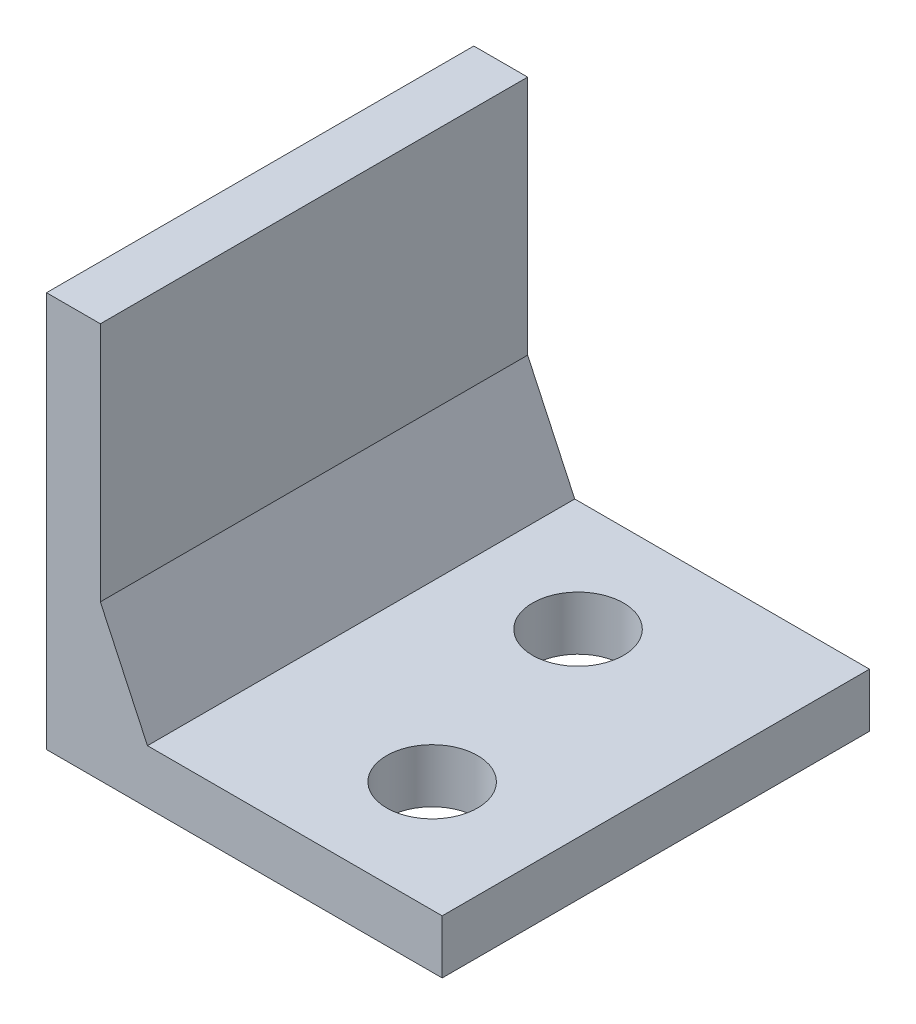
ISO-10303-21;
HEADER;
FILE_DESCRIPTION(('STEP AP214'),'2;1');
FILE_NAME('part.step','',(''),(''),'','','');
FILE_SCHEMA(('AUTOMOTIVE_DESIGN { 1 0 10303 214 1 1 1 1 }'));
ENDSEC;
DATA;
#1=APPLICATION_CONTEXT('core data for automotive mechanical design processes');
#2=APPLICATION_PROTOCOL_DEFINITION('international standard','automotive_design',2000,#1);
#3=PRODUCT_CONTEXT('',#1,'mechanical');
#4=PRODUCT('Part','Part','',(#3));
#5=PRODUCT_RELATED_PRODUCT_CATEGORY('part','',(#4));
#6=PRODUCT_DEFINITION_FORMATION('','',#4);
#7=PRODUCT_DEFINITION_CONTEXT('part definition',#1,'design');
#8=PRODUCT_DEFINITION('design','',#6,#7);
#9=PRODUCT_DEFINITION_SHAPE('','',#8);
#10=(LENGTH_UNIT() NAMED_UNIT(*) SI_UNIT(.MILLI.,.METRE.));
#11=(NAMED_UNIT(*) PLANE_ANGLE_UNIT() SI_UNIT($,.RADIAN.));
#12=(NAMED_UNIT(*) SI_UNIT($,.STERADIAN.) SOLID_ANGLE_UNIT());
#13=UNCERTAINTY_MEASURE_WITH_UNIT(LENGTH_MEASURE(1.E-05),#10,'distance_accuracy_value','');
#14=(GEOMETRIC_REPRESENTATION_CONTEXT(3) GLOBAL_UNCERTAINTY_ASSIGNED_CONTEXT((#13)) GLOBAL_UNIT_ASSIGNED_CONTEXT((#10,
#11,#12)) REPRESENTATION_CONTEXT('',''));
#15=CARTESIAN_POINT('',(0.,0.,0.));
#16=DIRECTION('',(0.,0.,1.));
#17=DIRECTION('',(1.,0.,0.));
#18=AXIS2_PLACEMENT_3D('',#15,#16,#17);
#19=CARTESIAN_POINT('',(29.4,0.,31.75));
#20=DIRECTION('',(0.,1.,0.));
#21=DIRECTION('',(-1.,0.,0.));
#22=AXIS2_PLACEMENT_3D('',#19,#20,#21);
#23=PLANE('',#22);
#24=CARTESIAN_POINT('',(20.4,0.,23.495));
#25=DIRECTION('',(0.,1.,0.));
#26=DIRECTION('',(0.,0.,1.));
#27=AXIS2_PLACEMENT_3D('',#24,#25,#26);
#28=CIRCLE('',#27,3.3782);
#29=CARTESIAN_POINT('',(20.4,0.,26.8732));
#30=VERTEX_POINT('',#29);
#31=EDGE_CURVE('E155',#30,#30,#28,.T.);
#32=ORIENTED_EDGE('',*,*,#31,.T.);
#33=EDGE_LOOP('',(#32));
#34=FACE_BOUND('',#33,.T.);
#35=CARTESIAN_POINT('',(16.,0.,8.255));
#36=DIRECTION('',(0.,1.,0.));
#37=DIRECTION('',(0.,0.,1.));
#38=AXIS2_PLACEMENT_3D('',#35,#36,#37);
#39=CIRCLE('',#38,3.3782);
#40=CARTESIAN_POINT('',(16.,0.,11.6332));
#41=VERTEX_POINT('',#40);
#42=EDGE_CURVE('E143',#41,#41,#39,.T.);
#43=ORIENTED_EDGE('',*,*,#42,.T.);
#44=EDGE_LOOP('',(#43));
#45=FACE_BOUND('',#44,.T.);
#46=DIRECTION('',(1.,0.,0.));
#47=VECTOR('',#46,1.);
#48=CARTESIAN_POINT('',(29.4,0.,0.));
#49=LINE('',#48,#47);
#50=CARTESIAN_POINT('',(0.,0.,0.));
#51=VERTEX_POINT('',#50);
#52=CARTESIAN_POINT('',(29.4,0.,0.));
#53=VERTEX_POINT('',#52);
#54=EDGE_CURVE('E117',#51,#53,#49,.T.);
#55=ORIENTED_EDGE('',*,*,#54,.T.);
#56=DIRECTION('',(0.,0.,-1.));
#57=VECTOR('',#56,1.);
#58=CARTESIAN_POINT('',(29.4,0.,31.75));
#59=LINE('',#58,#57);
#60=CARTESIAN_POINT('',(29.4,0.,31.75));
#61=VERTEX_POINT('',#60);
#62=EDGE_CURVE('E99',#61,#53,#59,.T.);
#63=ORIENTED_EDGE('',*,*,#62,.F.);
#64=DIRECTION('',(1.,0.,0.));
#65=VECTOR('',#64,1.);
#66=CARTESIAN_POINT('',(29.4,0.,31.75));
#67=LINE('',#66,#65);
#68=CARTESIAN_POINT('',(0.,0.,31.75));
#69=VERTEX_POINT('',#68);
#70=EDGE_CURVE('E105',#69,#61,#67,.T.);
#71=ORIENTED_EDGE('',*,*,#70,.F.);
#72=DIRECTION('',(0.,0.,-1.));
#73=VECTOR('',#72,1.);
#74=CARTESIAN_POINT('',(0.,0.,31.75));
#75=LINE('',#74,#73);
#76=EDGE_CURVE('E131',#69,#51,#75,.T.);
#77=ORIENTED_EDGE('',*,*,#76,.T.);
#78=EDGE_LOOP('',(#55,#63,#71,#77));
#79=FACE_BOUND('',#78,.T.);
#80=ADVANCED_FACE('F35',(#34,#45,#79),#23,.F.);
#81=CARTESIAN_POINT('',(29.4,4.,31.75));
#82=DIRECTION('',(-1.,0.,0.));
#83=DIRECTION('',(0.,0.,1.));
#84=AXIS2_PLACEMENT_3D('',#81,#82,#83);
#85=PLANE('',#84);
#86=DIRECTION('',(0.,1.,0.));
#87=VECTOR('',#86,1.);
#88=CARTESIAN_POINT('',(29.4,4.,0.));
#89=LINE('',#88,#87);
#90=CARTESIAN_POINT('',(29.4,4.,0.));
#91=VERTEX_POINT('',#90);
#92=EDGE_CURVE('E140',#53,#91,#89,.T.);
#93=ORIENTED_EDGE('',*,*,#92,.T.);
#94=DIRECTION('',(0.,0.,-1.));
#95=VECTOR('',#94,1.);
#96=CARTESIAN_POINT('',(29.4,4.,31.75));
#97=LINE('',#96,#95);
#98=CARTESIAN_POINT('',(29.4,4.,31.75));
#99=VERTEX_POINT('',#98);
#100=EDGE_CURVE('E102',#99,#91,#97,.T.);
#101=ORIENTED_EDGE('',*,*,#100,.F.);
#102=DIRECTION('',(0.,1.,0.));
#103=VECTOR('',#102,1.);
#104=CARTESIAN_POINT('',(29.4,4.,31.75));
#105=LINE('',#104,#103);
#106=EDGE_CURVE('E95',#61,#99,#105,.T.);
#107=ORIENTED_EDGE('',*,*,#106,.F.);
#108=ORIENTED_EDGE('',*,*,#62,.T.);
#109=EDGE_LOOP('',(#93,#101,#107,#108));
#110=FACE_BOUND('',#109,.T.);
#111=ADVANCED_FACE('F97',(#110),#85,.F.);
#112=CARTESIAN_POINT('',(4.,4.,31.75));
#113=DIRECTION('',(0.,-1.,0.));
#114=DIRECTION('',(1.,0.,0.));
#115=AXIS2_PLACEMENT_3D('',#112,#113,#114);
#116=PLANE('',#115);
#117=CARTESIAN_POINT('',(20.4,4.,23.495));
#118=DIRECTION('',(0.,1.,0.));
#119=DIRECTION('',(0.,0.,1.));
#120=AXIS2_PLACEMENT_3D('',#117,#118,#119);
#121=CIRCLE('',#120,3.37819999999999);
#122=CARTESIAN_POINT('',(20.4,4.,26.8732));
#123=VERTEX_POINT('',#122);
#124=EDGE_CURVE('E158',#123,#123,#121,.T.);
#125=ORIENTED_EDGE('',*,*,#124,.F.);
#126=EDGE_LOOP('',(#125));
#127=FACE_BOUND('',#126,.T.);
#128=CARTESIAN_POINT('',(16.,4.,8.255));
#129=DIRECTION('',(0.,1.,0.));
#130=DIRECTION('',(0.,0.,1.));
#131=AXIS2_PLACEMENT_3D('',#128,#129,#130);
#132=CIRCLE('',#131,3.37819999999999);
#133=CARTESIAN_POINT('',(16.,4.,11.6332));
#134=VERTEX_POINT('',#133);
#135=EDGE_CURVE('E152',#134,#134,#132,.T.);
#136=ORIENTED_EDGE('',*,*,#135,.F.);
#137=EDGE_LOOP('',(#136));
#138=FACE_BOUND('',#137,.T.);
#139=DIRECTION('',(-1.,0.,0.));
#140=VECTOR('',#139,1.);
#141=CARTESIAN_POINT('',(4.,4.,0.));
#142=LINE('',#141,#140);
#143=CARTESIAN_POINT('',(7.5,4.,0.));
#144=VERTEX_POINT('',#143);
#145=EDGE_CURVE('E138',#91,#144,#142,.T.);
#146=ORIENTED_EDGE('',*,*,#145,.T.);
#147=DIRECTION('',(0.,0.,1.));
#148=VECTOR('',#147,1.);
#149=CARTESIAN_POINT('',(7.5,4.,31.75));
#150=LINE('',#149,#148);
#151=CARTESIAN_POINT('',(7.5,4.,31.75));
#152=VERTEX_POINT('',#151);
#153=EDGE_CURVE('E51',#144,#152,#150,.T.);
#154=ORIENTED_EDGE('',*,*,#153,.T.);
#155=DIRECTION('',(-1.,0.,0.));
#156=VECTOR('',#155,1.);
#157=CARTESIAN_POINT('',(4.,4.,31.75));
#158=LINE('',#157,#156);
#159=EDGE_CURVE('E104',#99,#152,#158,.T.);
#160=ORIENTED_EDGE('',*,*,#159,.F.);
#161=ORIENTED_EDGE('',*,*,#100,.T.);
#162=EDGE_LOOP('',(#146,#154,#160,#161));
#163=FACE_BOUND('',#162,.T.);
#164=ADVANCED_FACE('F164',(#127,#138,#163),#116,.F.);
#165=CARTESIAN_POINT('',(4.,29.4,31.75));
#166=DIRECTION('',(-1.,0.,0.));
#167=DIRECTION('',(0.,-1.,0.));
#168=AXIS2_PLACEMENT_3D('',#165,#166,#167);
#169=PLANE('',#168);
#170=DIRECTION('',(0.,1.,0.));
#171=VECTOR('',#170,1.);
#172=CARTESIAN_POINT('',(4.,29.4,31.75));
#173=LINE('',#172,#171);
#174=CARTESIAN_POINT('',(4.,11.5057742217836,31.75));
#175=VERTEX_POINT('',#174);
#176=CARTESIAN_POINT('',(4.,29.4,31.75));
#177=VERTEX_POINT('',#176);
#178=EDGE_CURVE('E147',#175,#177,#173,.T.);
#179=ORIENTED_EDGE('',*,*,#178,.F.);
#180=DIRECTION('',(0.,0.,-1.));
#181=VECTOR('',#180,1.);
#182=CARTESIAN_POINT('',(4.,11.5057742217836,0.));
#183=LINE('',#182,#181);
#184=CARTESIAN_POINT('',(4.,11.5057742217836,0.));
#185=VERTEX_POINT('',#184);
#186=EDGE_CURVE('E118',#175,#185,#183,.T.);
#187=ORIENTED_EDGE('',*,*,#186,.T.);
#188=DIRECTION('',(0.,1.,0.));
#189=VECTOR('',#188,1.);
#190=CARTESIAN_POINT('',(4.,29.4,0.));
#191=LINE('',#190,#189);
#192=CARTESIAN_POINT('',(4.,29.4,0.));
#193=VERTEX_POINT('',#192);
#194=EDGE_CURVE('E136',#185,#193,#191,.T.);
#195=ORIENTED_EDGE('',*,*,#194,.T.);
#196=DIRECTION('',(0.,0.,-1.));
#197=VECTOR('',#196,1.);
#198=CARTESIAN_POINT('',(4.,29.4,31.75));
#199=LINE('',#198,#197);
#200=EDGE_CURVE('E122',#177,#193,#199,.T.);
#201=ORIENTED_EDGE('',*,*,#200,.F.);
#202=EDGE_LOOP('',(#179,#187,#195,#201));
#203=FACE_BOUND('',#202,.T.);
#204=ADVANCED_FACE('F167',(#203),#169,.F.);
#205=CARTESIAN_POINT('',(0.,29.4,31.75));
#206=DIRECTION('',(0.,-1.,0.));
#207=DIRECTION('',(0.,0.,-1.));
#208=AXIS2_PLACEMENT_3D('',#205,#206,#207);
#209=PLANE('',#208);
#210=DIRECTION('',(-1.,0.,0.));
#211=VECTOR('',#210,1.);
#212=CARTESIAN_POINT('',(0.,29.4,0.));
#213=LINE('',#212,#211);
#214=CARTESIAN_POINT('',(0.,29.4,0.));
#215=VERTEX_POINT('',#214);
#216=EDGE_CURVE('E134',#193,#215,#213,.T.);
#217=ORIENTED_EDGE('',*,*,#216,.T.);
#218=DIRECTION('',(0.,0.,-1.));
#219=VECTOR('',#218,1.);
#220=CARTESIAN_POINT('',(0.,29.4,31.75));
#221=LINE('',#220,#219);
#222=CARTESIAN_POINT('',(0.,29.4,31.75));
#223=VERTEX_POINT('',#222);
#224=EDGE_CURVE('E128',#223,#215,#221,.T.);
#225=ORIENTED_EDGE('',*,*,#224,.F.);
#226=DIRECTION('',(-1.,0.,0.));
#227=VECTOR('',#226,1.);
#228=CARTESIAN_POINT('',(0.,29.4,31.75));
#229=LINE('',#228,#227);
#230=EDGE_CURVE('E145',#177,#223,#229,.T.);
#231=ORIENTED_EDGE('',*,*,#230,.F.);
#232=ORIENTED_EDGE('',*,*,#200,.T.);
#233=EDGE_LOOP('',(#217,#225,#231,#232));
#234=FACE_BOUND('',#233,.T.);
#235=ADVANCED_FACE('F180',(#234),#209,.F.);
#236=CARTESIAN_POINT('',(0.,0.,31.75));
#237=DIRECTION('',(1.,0.,0.));
#238=DIRECTION('',(0.,1.,0.));
#239=AXIS2_PLACEMENT_3D('',#236,#237,#238);
#240=PLANE('',#239);
#241=DIRECTION('',(0.,-1.,0.));
#242=VECTOR('',#241,1.);
#243=CARTESIAN_POINT('',(0.,0.,0.));
#244=LINE('',#243,#242);
#245=EDGE_CURVE('E114',#215,#51,#244,.T.);
#246=ORIENTED_EDGE('',*,*,#245,.T.);
#247=ORIENTED_EDGE('',*,*,#76,.F.);
#248=DIRECTION('',(0.,-1.,0.));
#249=VECTOR('',#248,1.);
#250=CARTESIAN_POINT('',(0.,0.,31.75));
#251=LINE('',#250,#249);
#252=EDGE_CURVE('E110',#223,#69,#251,.T.);
#253=ORIENTED_EDGE('',*,*,#252,.F.);
#254=ORIENTED_EDGE('',*,*,#224,.T.);
#255=EDGE_LOOP('',(#246,#247,#253,#254));
#256=FACE_BOUND('',#255,.T.);
#257=ADVANCED_FACE('F183',(#256),#240,.F.);
#258=CARTESIAN_POINT('',(0.,0.,31.75));
#259=DIRECTION('',(0.,0.,-1.));
#260=DIRECTION('',(-1.,0.,0.));
#261=AXIS2_PLACEMENT_3D('',#258,#259,#260);
#262=PLANE('',#261);
#263=ORIENTED_EDGE('',*,*,#70,.T.);
#264=ORIENTED_EDGE('',*,*,#106,.T.);
#265=ORIENTED_EDGE('',*,*,#159,.T.);
#266=DIRECTION('',(0.422618261740694,-0.906307787036652,0.));
#267=VECTOR('',#266,1.);
#268=CARTESIAN_POINT('',(7.69254242256249,3.58709144232304,31.75));
#269=LINE('',#268,#267);
#270=EDGE_CURVE('E11',#152,#175,#269,.F.);
#271=ORIENTED_EDGE('',*,*,#270,.T.);
#272=ORIENTED_EDGE('',*,*,#178,.T.);
#273=ORIENTED_EDGE('',*,*,#230,.T.);
#274=ORIENTED_EDGE('',*,*,#252,.T.);
#275=EDGE_LOOP('',(#263,#264,#265,#271,#272,#273,#274));
#276=FACE_BOUND('',#275,.T.);
#277=ADVANCED_FACE('F108',(#276),#262,.F.);
#278=CARTESIAN_POINT('',(0.,0.,0.));
#279=DIRECTION('',(0.,0.,-1.));
#280=DIRECTION('',(-1.,0.,0.));
#281=AXIS2_PLACEMENT_3D('',#278,#279,#280);
#282=PLANE('',#281);
#283=ORIENTED_EDGE('',*,*,#54,.F.);
#284=ORIENTED_EDGE('',*,*,#245,.F.);
#285=ORIENTED_EDGE('',*,*,#216,.F.);
#286=ORIENTED_EDGE('',*,*,#194,.F.);
#287=DIRECTION('',(-0.422618261740694,0.906307787036652,0.));
#288=VECTOR('',#287,1.);
#289=CARTESIAN_POINT('',(4.,11.5057742217836,0.));
#290=LINE('',#289,#288);
#291=EDGE_CURVE('E44',#185,#144,#290,.F.);
#292=ORIENTED_EDGE('',*,*,#291,.T.);
#293=ORIENTED_EDGE('',*,*,#145,.F.);
#294=ORIENTED_EDGE('',*,*,#92,.F.);
#295=EDGE_LOOP('',(#283,#284,#285,#286,#292,#293,#294));
#296=FACE_BOUND('',#295,.T.);
#297=ADVANCED_FACE('F184',(#296),#282,.T.);
#298=CARTESIAN_POINT('',(16.,4.,8.255));
#299=DIRECTION('',(0.,1.,0.));
#300=DIRECTION('',(0.,0.,1.));
#301=AXIS2_PLACEMENT_3D('',#298,#299,#300);
#302=CYLINDRICAL_SURFACE('',#301,3.37819999999999);
#303=ORIENTED_EDGE('',*,*,#42,.F.);
#304=EDGE_LOOP('',(#303));
#305=FACE_BOUND('',#304,.T.);
#306=ORIENTED_EDGE('',*,*,#135,.T.);
#307=EDGE_LOOP('',(#306));
#308=FACE_BOUND('',#307,.T.);
#309=ADVANCED_FACE('F186',(#305,#308),#302,.F.);
#310=CARTESIAN_POINT('',(20.4,4.,23.495));
#311=DIRECTION('',(0.,1.,0.));
#312=DIRECTION('',(0.,0.,1.));
#313=AXIS2_PLACEMENT_3D('',#310,#311,#312);
#314=CYLINDRICAL_SURFACE('',#313,3.37819999999999);
#315=ORIENTED_EDGE('',*,*,#31,.F.);
#316=EDGE_LOOP('',(#315));
#317=FACE_BOUND('',#316,.T.);
#318=ORIENTED_EDGE('',*,*,#124,.T.);
#319=EDGE_LOOP('',(#318));
#320=FACE_BOUND('',#319,.T.);
#321=ADVANCED_FACE('F162',(#317,#320),#314,.F.);
#322=CARTESIAN_POINT('',(4.,11.5057742217836,31.75));
#323=DIRECTION('',(0.906307787036652,0.422618261740694,0.));
#324=DIRECTION('',(0.,0.,1.));
#325=AXIS2_PLACEMENT_3D('',#322,#323,#324);
#326=PLANE('',#325);
#327=ORIENTED_EDGE('',*,*,#270,.F.);
#328=ORIENTED_EDGE('',*,*,#153,.F.);
#329=ORIENTED_EDGE('',*,*,#291,.F.);
#330=ORIENTED_EDGE('',*,*,#186,.F.);
#331=EDGE_LOOP('',(#327,#328,#329,#330));
#332=FACE_BOUND('',#331,.T.);
#333=ADVANCED_FACE('F38',(#332),#326,.T.);
#334=CLOSED_SHELL('',(#80,#111,#164,#204,#235,#257,#277,#297,#309,#321,#333));
#335=MANIFOLD_SOLID_BREP('B2',#334);
#336=ADVANCED_BREP_SHAPE_REPRESENTATION('',(#18,#335),#14);
#337=SHAPE_DEFINITION_REPRESENTATION(#9,#336);
ENDSEC;
END-ISO-10303-21;
